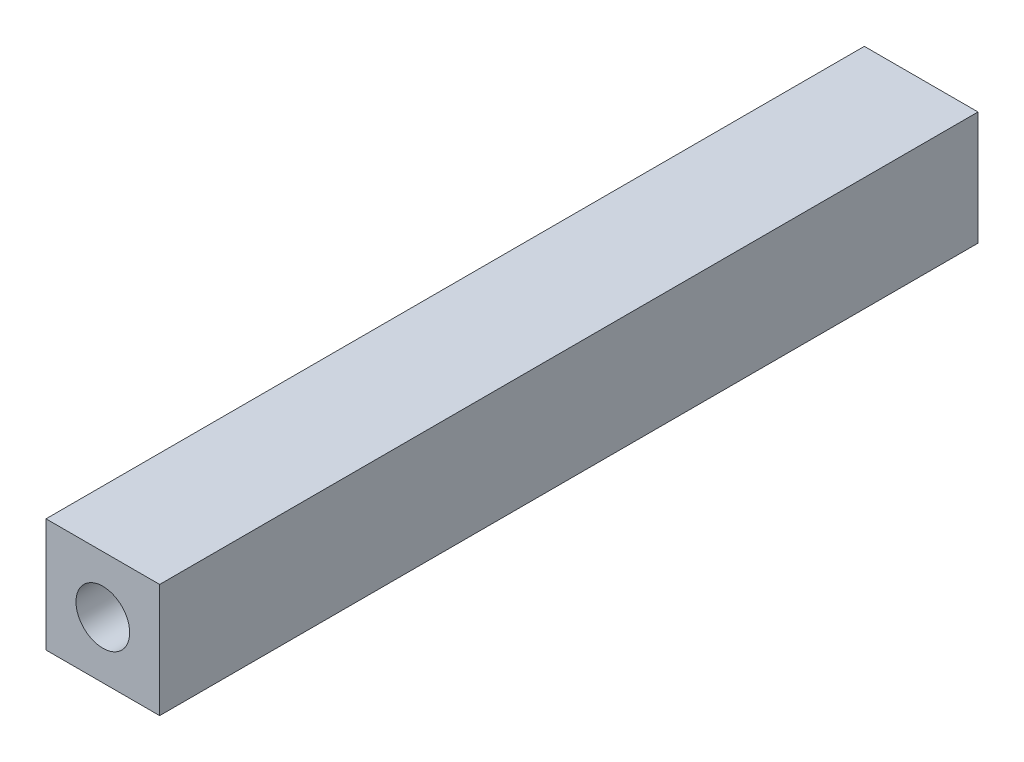
ISO-10303-21;
HEADER;
FILE_DESCRIPTION(('STEP AP214'),'2;1');
FILE_NAME('part.step','',(''),(''),'','','');
FILE_SCHEMA(('AUTOMOTIVE_DESIGN { 1 0 10303 214 1 1 1 1 }'));
ENDSEC;
DATA;
#1=APPLICATION_CONTEXT('core data for automotive mechanical design processes');
#2=APPLICATION_PROTOCOL_DEFINITION('international standard','automotive_design',2000,#1);
#3=PRODUCT_CONTEXT('',#1,'mechanical');
#4=PRODUCT('Part','Part','',(#3));
#5=PRODUCT_RELATED_PRODUCT_CATEGORY('part','',(#4));
#6=PRODUCT_DEFINITION_FORMATION('','',#4);
#7=PRODUCT_DEFINITION_CONTEXT('part definition',#1,'design');
#8=PRODUCT_DEFINITION('design','',#6,#7);
#9=PRODUCT_DEFINITION_SHAPE('','',#8);
#10=(LENGTH_UNIT() NAMED_UNIT(*) SI_UNIT(.MILLI.,.METRE.));
#11=(NAMED_UNIT(*) PLANE_ANGLE_UNIT() SI_UNIT($,.RADIAN.));
#12=(NAMED_UNIT(*) SI_UNIT($,.STERADIAN.) SOLID_ANGLE_UNIT());
#13=UNCERTAINTY_MEASURE_WITH_UNIT(LENGTH_MEASURE(1.E-05),#10,'distance_accuracy_value','');
#14=(GEOMETRIC_REPRESENTATION_CONTEXT(3) GLOBAL_UNCERTAINTY_ASSIGNED_CONTEXT((#13)) GLOBAL_UNIT_ASSIGNED_CONTEXT((#10,
#11,#12)) REPRESENTATION_CONTEXT('',''));
#15=CARTESIAN_POINT('',(0.,0.,0.));
#16=DIRECTION('',(0.,0.,1.));
#17=DIRECTION('',(1.,0.,0.));
#18=AXIS2_PLACEMENT_3D('',#15,#16,#17);
#19=CARTESIAN_POINT('',(0.,0.,45.72));
#20=DIRECTION('',(0.,0.,1.));
#21=DIRECTION('',(1.,0.,0.));
#22=AXIS2_PLACEMENT_3D('',#19,#20,#21);
#23=PLANE('',#22);
#24=DIRECTION('',(0.,-1.,0.));
#25=VECTOR('',#24,1.);
#26=CARTESIAN_POINT('',(-3.175,-3.175,45.72));
#27=LINE('',#26,#25);
#28=CARTESIAN_POINT('',(-3.175,3.175,45.72));
#29=VERTEX_POINT('',#28);
#30=CARTESIAN_POINT('',(-3.175,-3.175,45.72));
#31=VERTEX_POINT('',#30);
#32=EDGE_CURVE('E92',#29,#31,#27,.T.);
#33=ORIENTED_EDGE('',*,*,#32,.T.);
#34=DIRECTION('',(1.,0.,0.));
#35=VECTOR('',#34,1.);
#36=CARTESIAN_POINT('',(3.175,-3.175,45.72));
#37=LINE('',#36,#35);
#38=CARTESIAN_POINT('',(3.175,-3.175,45.72));
#39=VERTEX_POINT('',#38);
#40=EDGE_CURVE('E87',#31,#39,#37,.T.);
#41=ORIENTED_EDGE('',*,*,#40,.T.);
#42=DIRECTION('',(0.,1.,0.));
#43=VECTOR('',#42,1.);
#44=CARTESIAN_POINT('',(3.175,-3.175,45.72));
#45=LINE('',#44,#43);
#46=CARTESIAN_POINT('',(3.175,3.175,45.72));
#47=VERTEX_POINT('',#46);
#48=EDGE_CURVE('E90',#39,#47,#45,.T.);
#49=ORIENTED_EDGE('',*,*,#48,.T.);
#50=DIRECTION('',(-1.,0.,0.));
#51=VECTOR('',#50,1.);
#52=CARTESIAN_POINT('',(3.175,3.175,45.72));
#53=LINE('',#52,#51);
#54=EDGE_CURVE('E57',#47,#29,#53,.T.);
#55=ORIENTED_EDGE('',*,*,#54,.T.);
#56=EDGE_LOOP('',(#33,#41,#49,#55));
#57=FACE_BOUND('',#56,.T.);
#58=CARTESIAN_POINT('',(0.,0.,45.72));
#59=DIRECTION('',(0.,0.,1.));
#60=DIRECTION('',(1.,0.,0.));
#61=AXIS2_PLACEMENT_3D('',#58,#59,#60);
#62=CIRCLE('',#61,1.5);
#63=CARTESIAN_POINT('',(1.5,0.,45.72));
#64=VERTEX_POINT('',#63);
#65=EDGE_CURVE('E112',#64,#64,#62,.T.);
#66=ORIENTED_EDGE('',*,*,#65,.F.);
#67=EDGE_LOOP('',(#66));
#68=FACE_BOUND('',#67,.T.);
#69=ADVANCED_FACE('F39',(#57,#68),#23,.T.);
#70=CARTESIAN_POINT('',(0.,0.,0.));
#71=DIRECTION('',(0.,0.,1.));
#72=DIRECTION('',(1.,0.,0.));
#73=AXIS2_PLACEMENT_3D('',#70,#71,#72);
#74=PLANE('',#73);
#75=DIRECTION('',(0.,-1.,0.));
#76=VECTOR('',#75,1.);
#77=CARTESIAN_POINT('',(-3.175,-3.175,0.));
#78=LINE('',#77,#76);
#79=CARTESIAN_POINT('',(-3.175,3.175,0.));
#80=VERTEX_POINT('',#79);
#81=CARTESIAN_POINT('',(-3.175,-3.175,0.));
#82=VERTEX_POINT('',#81);
#83=EDGE_CURVE('E108',#80,#82,#78,.T.);
#84=ORIENTED_EDGE('',*,*,#83,.F.);
#85=DIRECTION('',(-1.,0.,0.));
#86=VECTOR('',#85,1.);
#87=CARTESIAN_POINT('',(3.175,3.175,0.));
#88=LINE('',#87,#86);
#89=CARTESIAN_POINT('',(3.175,3.175,0.));
#90=VERTEX_POINT('',#89);
#91=EDGE_CURVE('E80',#90,#80,#88,.T.);
#92=ORIENTED_EDGE('',*,*,#91,.F.);
#93=DIRECTION('',(0.,1.,0.));
#94=VECTOR('',#93,1.);
#95=CARTESIAN_POINT('',(3.175,-3.175,0.));
#96=LINE('',#95,#94);
#97=CARTESIAN_POINT('',(3.175,-3.175,0.));
#98=VERTEX_POINT('',#97);
#99=EDGE_CURVE('E74',#98,#90,#96,.T.);
#100=ORIENTED_EDGE('',*,*,#99,.F.);
#101=DIRECTION('',(1.,0.,0.));
#102=VECTOR('',#101,1.);
#103=CARTESIAN_POINT('',(3.175,-3.175,0.));
#104=LINE('',#103,#102);
#105=EDGE_CURVE('E97',#82,#98,#104,.T.);
#106=ORIENTED_EDGE('',*,*,#105,.F.);
#107=EDGE_LOOP('',(#84,#92,#100,#106));
#108=FACE_BOUND('',#107,.T.);
#109=CARTESIAN_POINT('',(0.,0.,0.));
#110=DIRECTION('',(0.,0.,1.));
#111=DIRECTION('',(1.,0.,0.));
#112=AXIS2_PLACEMENT_3D('',#109,#110,#111);
#113=CIRCLE('',#112,1.5);
#114=CARTESIAN_POINT('',(1.5,0.,0.));
#115=VERTEX_POINT('',#114);
#116=EDGE_CURVE('E130',#115,#115,#113,.T.);
#117=ORIENTED_EDGE('',*,*,#116,.T.);
#118=EDGE_LOOP('',(#117));
#119=FACE_BOUND('',#118,.T.);
#120=ADVANCED_FACE('F125',(#108,#119),#74,.F.);
#121=CARTESIAN_POINT('',(-3.175,-3.175,45.72));
#122=DIRECTION('',(1.,0.,0.));
#123=DIRECTION('',(0.,0.,-1.));
#124=AXIS2_PLACEMENT_3D('',#121,#122,#123);
#125=PLANE('',#124);
#126=ORIENTED_EDGE('',*,*,#83,.T.);
#127=DIRECTION('',(0.,0.,-1.));
#128=VECTOR('',#127,1.);
#129=CARTESIAN_POINT('',(-3.175,-3.175,45.72));
#130=LINE('',#129,#128);
#131=EDGE_CURVE('E11',#31,#82,#130,.T.);
#132=ORIENTED_EDGE('',*,*,#131,.F.);
#133=ORIENTED_EDGE('',*,*,#32,.F.);
#134=DIRECTION('',(0.,0.,-1.));
#135=VECTOR('',#134,1.);
#136=CARTESIAN_POINT('',(-3.175,3.175,45.72));
#137=LINE('',#136,#135);
#138=EDGE_CURVE('E104',#29,#80,#137,.T.);
#139=ORIENTED_EDGE('',*,*,#138,.T.);
#140=EDGE_LOOP('',(#126,#132,#133,#139));
#141=FACE_BOUND('',#140,.T.);
#142=ADVANCED_FACE('F41',(#141),#125,.F.);
#143=CARTESIAN_POINT('',(3.175,-3.175,45.72));
#144=DIRECTION('',(0.,1.,0.));
#145=DIRECTION('',(-1.,0.,0.));
#146=AXIS2_PLACEMENT_3D('',#143,#144,#145);
#147=PLANE('',#146);
#148=ORIENTED_EDGE('',*,*,#105,.T.);
#149=DIRECTION('',(0.,0.,-1.));
#150=VECTOR('',#149,1.);
#151=CARTESIAN_POINT('',(3.175,-3.175,45.72));
#152=LINE('',#151,#150);
#153=EDGE_CURVE('E49',#39,#98,#152,.T.);
#154=ORIENTED_EDGE('',*,*,#153,.F.);
#155=ORIENTED_EDGE('',*,*,#40,.F.);
#156=ORIENTED_EDGE('',*,*,#131,.T.);
#157=EDGE_LOOP('',(#148,#154,#155,#156));
#158=FACE_BOUND('',#157,.T.);
#159=ADVANCED_FACE('F96',(#158),#147,.F.);
#160=CARTESIAN_POINT('',(3.175,-3.175,45.72));
#161=DIRECTION('',(-1.,0.,0.));
#162=DIRECTION('',(0.,0.,1.));
#163=AXIS2_PLACEMENT_3D('',#160,#161,#162);
#164=PLANE('',#163);
#165=ORIENTED_EDGE('',*,*,#99,.T.);
#166=DIRECTION('',(0.,0.,-1.));
#167=VECTOR('',#166,1.);
#168=CARTESIAN_POINT('',(3.175,3.175,45.72));
#169=LINE('',#168,#167);
#170=EDGE_CURVE('E99',#47,#90,#169,.T.);
#171=ORIENTED_EDGE('',*,*,#170,.F.);
#172=ORIENTED_EDGE('',*,*,#48,.F.);
#173=ORIENTED_EDGE('',*,*,#153,.T.);
#174=EDGE_LOOP('',(#165,#171,#172,#173));
#175=FACE_BOUND('',#174,.T.);
#176=ADVANCED_FACE('F100',(#175),#164,.F.);
#177=CARTESIAN_POINT('',(3.175,3.175,45.72));
#178=DIRECTION('',(0.,-1.,0.));
#179=DIRECTION('',(1.,0.,0.));
#180=AXIS2_PLACEMENT_3D('',#177,#178,#179);
#181=PLANE('',#180);
#182=ORIENTED_EDGE('',*,*,#91,.T.);
#183=ORIENTED_EDGE('',*,*,#138,.F.);
#184=ORIENTED_EDGE('',*,*,#54,.F.);
#185=ORIENTED_EDGE('',*,*,#170,.T.);
#186=EDGE_LOOP('',(#182,#183,#184,#185));
#187=FACE_BOUND('',#186,.T.);
#188=ADVANCED_FACE('F122',(#187),#181,.F.);
#189=CARTESIAN_POINT('',(0.,0.,45.72));
#190=DIRECTION('',(0.,0.,-1.));
#191=DIRECTION('',(-1.,0.,0.));
#192=AXIS2_PLACEMENT_3D('',#189,#190,#191);
#193=CYLINDRICAL_SURFACE('',#192,1.5);
#194=ORIENTED_EDGE('',*,*,#65,.T.);
#195=EDGE_LOOP('',(#194));
#196=FACE_BOUND('',#195,.T.);
#197=ORIENTED_EDGE('',*,*,#116,.F.);
#198=EDGE_LOOP('',(#197));
#199=FACE_BOUND('',#198,.T.);
#200=ADVANCED_FACE('F138',(#196,#199),#193,.F.);
#201=CLOSED_SHELL('',(#69,#120,#142,#159,#176,#188,#200));
#202=MANIFOLD_SOLID_BREP('B2',#201);
#203=ADVANCED_BREP_SHAPE_REPRESENTATION('',(#18,#202),#14);
#204=SHAPE_DEFINITION_REPRESENTATION(#9,#203);
ENDSEC;
END-ISO-10303-21;
